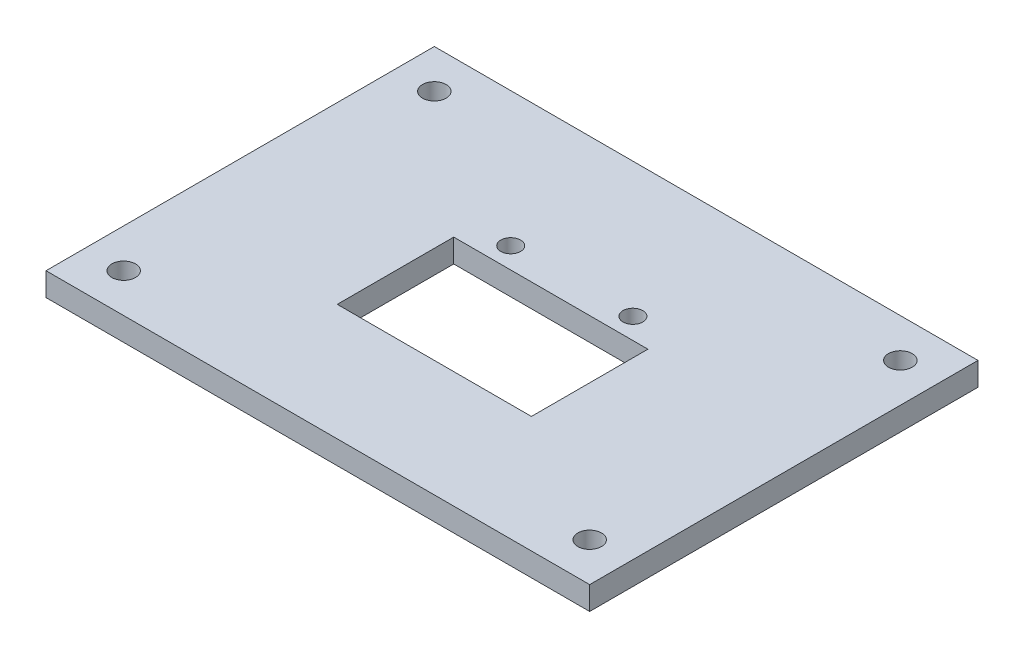
ISO-10303-21;
HEADER;
FILE_DESCRIPTION(('STEP AP214'),'2;1');
FILE_NAME('part.step','',(''),(''),'','','');
FILE_SCHEMA(('AUTOMOTIVE_DESIGN { 1 0 10303 214 1 1 1 1 }'));
ENDSEC;
DATA;
#1=APPLICATION_CONTEXT('core data for automotive mechanical design processes');
#2=APPLICATION_PROTOCOL_DEFINITION('international standard','automotive_design',2000,#1);
#3=PRODUCT_CONTEXT('',#1,'mechanical');
#4=PRODUCT('Part','Part','',(#3));
#5=PRODUCT_RELATED_PRODUCT_CATEGORY('part','',(#4));
#6=PRODUCT_DEFINITION_FORMATION('','',#4);
#7=PRODUCT_DEFINITION_CONTEXT('part definition',#1,'design');
#8=PRODUCT_DEFINITION('design','',#6,#7);
#9=PRODUCT_DEFINITION_SHAPE('','',#8);
#10=(LENGTH_UNIT() NAMED_UNIT(*) SI_UNIT(.MILLI.,.METRE.));
#11=(NAMED_UNIT(*) PLANE_ANGLE_UNIT() SI_UNIT($,.RADIAN.));
#12=(NAMED_UNIT(*) SI_UNIT($,.STERADIAN.) SOLID_ANGLE_UNIT());
#13=UNCERTAINTY_MEASURE_WITH_UNIT(LENGTH_MEASURE(1.E-05),#10,'distance_accuracy_value','');
#14=(GEOMETRIC_REPRESENTATION_CONTEXT(3) GLOBAL_UNCERTAINTY_ASSIGNED_CONTEXT((#13)) GLOBAL_UNIT_ASSIGNED_CONTEXT((#10,
#11,#12)) REPRESENTATION_CONTEXT('',''));
#15=CARTESIAN_POINT('',(0.,0.,0.));
#16=DIRECTION('',(0.,0.,1.));
#17=DIRECTION('',(1.,0.,0.));
#18=AXIS2_PLACEMENT_3D('',#15,#16,#17);
#19=CARTESIAN_POINT('',(0.,3.,0.));
#20=DIRECTION('',(1.,0.,0.));
#21=DIRECTION('',(0.,0.,-1.));
#22=AXIS2_PLACEMENT_3D('',#19,#20,#21);
#23=PLANE('',#22);
#24=DIRECTION('',(0.,0.,1.));
#25=VECTOR('',#24,1.);
#26=CARTESIAN_POINT('',(0.,0.,0.));
#27=LINE('',#26,#25);
#28=CARTESIAN_POINT('',(0.,0.,-50.));
#29=VERTEX_POINT('',#28);
#30=CARTESIAN_POINT('',(0.,0.,0.));
#31=VERTEX_POINT('',#30);
#32=EDGE_CURVE('E134',#29,#31,#27,.T.);
#33=ORIENTED_EDGE('',*,*,#32,.T.);
#34=DIRECTION('',(0.,-1.,0.));
#35=VECTOR('',#34,1.);
#36=CARTESIAN_POINT('',(0.,3.,0.));
#37=LINE('',#36,#35);
#38=CARTESIAN_POINT('',(0.,3.,0.));
#39=VERTEX_POINT('',#38);
#40=EDGE_CURVE('E11',#39,#31,#37,.T.);
#41=ORIENTED_EDGE('',*,*,#40,.F.);
#42=DIRECTION('',(0.,0.,1.));
#43=VECTOR('',#42,1.);
#44=CARTESIAN_POINT('',(0.,3.,0.));
#45=LINE('',#44,#43);
#46=CARTESIAN_POINT('',(0.,3.,-50.));
#47=VERTEX_POINT('',#46);
#48=EDGE_CURVE('E150',#47,#39,#45,.T.);
#49=ORIENTED_EDGE('',*,*,#48,.F.);
#50=DIRECTION('',(0.,-1.,0.));
#51=VECTOR('',#50,1.);
#52=CARTESIAN_POINT('',(0.,3.,-50.));
#53=LINE('',#52,#51);
#54=EDGE_CURVE('E160',#47,#29,#53,.T.);
#55=ORIENTED_EDGE('',*,*,#54,.T.);
#56=EDGE_LOOP('',(#33,#41,#49,#55));
#57=FACE_BOUND('',#56,.T.);
#58=ADVANCED_FACE('F33',(#57),#23,.F.);
#59=CARTESIAN_POINT('',(0.,3.,0.));
#60=DIRECTION('',(0.,0.,-1.));
#61=DIRECTION('',(-1.,0.,0.));
#62=AXIS2_PLACEMENT_3D('',#59,#60,#61);
#63=PLANE('',#62);
#64=DIRECTION('',(1.,0.,0.));
#65=VECTOR('',#64,1.);
#66=CARTESIAN_POINT('',(0.,0.,0.));
#67=LINE('',#66,#65);
#68=CARTESIAN_POINT('',(70.,0.,0.));
#69=VERTEX_POINT('',#68);
#70=EDGE_CURVE('E163',#31,#69,#67,.T.);
#71=ORIENTED_EDGE('',*,*,#70,.T.);
#72=DIRECTION('',(0.,-1.,0.));
#73=VECTOR('',#72,1.);
#74=CARTESIAN_POINT('',(70.,3.,0.));
#75=LINE('',#74,#73);
#76=CARTESIAN_POINT('',(70.,3.,0.));
#77=VERTEX_POINT('',#76);
#78=EDGE_CURVE('E40',#77,#69,#75,.T.);
#79=ORIENTED_EDGE('',*,*,#78,.F.);
#80=DIRECTION('',(1.,0.,0.));
#81=VECTOR('',#80,1.);
#82=CARTESIAN_POINT('',(0.,3.,0.));
#83=LINE('',#82,#81);
#84=EDGE_CURVE('E153',#39,#77,#83,.T.);
#85=ORIENTED_EDGE('',*,*,#84,.F.);
#86=ORIENTED_EDGE('',*,*,#40,.T.);
#87=EDGE_LOOP('',(#71,#79,#85,#86));
#88=FACE_BOUND('',#87,.T.);
#89=ADVANCED_FACE('F192',(#88),#63,.F.);
#90=CARTESIAN_POINT('',(70.,3.,0.));
#91=DIRECTION('',(-1.,0.,0.));
#92=DIRECTION('',(0.,0.,1.));
#93=AXIS2_PLACEMENT_3D('',#90,#91,#92);
#94=PLANE('',#93);
#95=DIRECTION('',(0.,0.,-1.));
#96=VECTOR('',#95,1.);
#97=CARTESIAN_POINT('',(70.,0.,0.));
#98=LINE('',#97,#96);
#99=CARTESIAN_POINT('',(70.,0.,-50.));
#100=VERTEX_POINT('',#99);
#101=EDGE_CURVE('E165',#69,#100,#98,.T.);
#102=ORIENTED_EDGE('',*,*,#101,.T.);
#103=DIRECTION('',(0.,-1.,0.));
#104=VECTOR('',#103,1.);
#105=CARTESIAN_POINT('',(70.,3.,-50.));
#106=LINE('',#105,#104);
#107=CARTESIAN_POINT('',(70.,3.,-50.));
#108=VERTEX_POINT('',#107);
#109=EDGE_CURVE('E170',#108,#100,#106,.T.);
#110=ORIENTED_EDGE('',*,*,#109,.F.);
#111=DIRECTION('',(0.,0.,-1.));
#112=VECTOR('',#111,1.);
#113=CARTESIAN_POINT('',(70.,3.,0.));
#114=LINE('',#113,#112);
#115=EDGE_CURVE('E156',#77,#108,#114,.T.);
#116=ORIENTED_EDGE('',*,*,#115,.F.);
#117=ORIENTED_EDGE('',*,*,#78,.T.);
#118=EDGE_LOOP('',(#102,#110,#116,#117));
#119=FACE_BOUND('',#118,.T.);
#120=ADVANCED_FACE('F177',(#119),#94,.F.);
#121=CARTESIAN_POINT('',(0.,3.,-50.));
#122=DIRECTION('',(0.,0.,1.));
#123=DIRECTION('',(1.,0.,0.));
#124=AXIS2_PLACEMENT_3D('',#121,#122,#123);
#125=PLANE('',#124);
#126=DIRECTION('',(-1.,0.,0.));
#127=VECTOR('',#126,1.);
#128=CARTESIAN_POINT('',(0.,0.,-50.));
#129=LINE('',#128,#127);
#130=EDGE_CURVE('E154',#100,#29,#129,.T.);
#131=ORIENTED_EDGE('',*,*,#130,.T.);
#132=ORIENTED_EDGE('',*,*,#54,.F.);
#133=DIRECTION('',(-1.,0.,0.));
#134=VECTOR('',#133,1.);
#135=CARTESIAN_POINT('',(0.,3.,-50.));
#136=LINE('',#135,#134);
#137=EDGE_CURVE('E158',#108,#47,#136,.T.);
#138=ORIENTED_EDGE('',*,*,#137,.F.);
#139=ORIENTED_EDGE('',*,*,#109,.T.);
#140=EDGE_LOOP('',(#131,#132,#138,#139));
#141=FACE_BOUND('',#140,.T.);
#142=ADVANCED_FACE('F185',(#141),#125,.F.);
#143=CARTESIAN_POINT('',(0.,3.,0.));
#144=DIRECTION('',(0.,-1.,0.));
#145=DIRECTION('',(0.,0.,-1.));
#146=AXIS2_PLACEMENT_3D('',#143,#144,#145);
#147=PLANE('',#146);
#148=CARTESIAN_POINT('',(5.,3.,-5.00000000000002));
#149=DIRECTION('',(0.,1.,0.));
#150=DIRECTION('',(0.,0.,-1.));
#151=AXIS2_PLACEMENT_3D('',#148,#149,#150);
#152=CIRCLE('',#151,1.525);
#153=CARTESIAN_POINT('',(5.,3.,-6.52500000000002));
#154=VERTEX_POINT('',#153);
#155=EDGE_CURVE('E264',#154,#154,#152,.T.);
#156=ORIENTED_EDGE('',*,*,#155,.F.);
#157=EDGE_LOOP('',(#156));
#158=FACE_BOUND('',#157,.T.);
#159=CARTESIAN_POINT('',(65.,3.,-5.00000000000002));
#160=DIRECTION('',(0.,1.,0.));
#161=DIRECTION('',(0.,0.,1.));
#162=AXIS2_PLACEMENT_3D('',#159,#160,#161);
#163=CIRCLE('',#162,1.52500000000001);
#164=CARTESIAN_POINT('',(65.,3.,-3.47500000000001));
#165=VERTEX_POINT('',#164);
#166=EDGE_CURVE('E256',#165,#165,#163,.T.);
#167=ORIENTED_EDGE('',*,*,#166,.F.);
#168=EDGE_LOOP('',(#167));
#169=FACE_BOUND('',#168,.T.);
#170=CARTESIAN_POINT('',(65.,3.,-45.));
#171=DIRECTION('',(0.,1.,0.));
#172=DIRECTION('',(0.,0.,-1.));
#173=AXIS2_PLACEMENT_3D('',#170,#171,#172);
#174=CIRCLE('',#173,1.52500000000001);
#175=CARTESIAN_POINT('',(65.,3.,-46.525));
#176=VERTEX_POINT('',#175);
#177=EDGE_CURVE('E250',#176,#176,#174,.T.);
#178=ORIENTED_EDGE('',*,*,#177,.F.);
#179=EDGE_LOOP('',(#178));
#180=FACE_BOUND('',#179,.T.);
#181=CARTESIAN_POINT('',(5.,3.,-45.));
#182=DIRECTION('',(0.,1.,0.));
#183=DIRECTION('',(0.,0.,1.));
#184=AXIS2_PLACEMENT_3D('',#181,#182,#183);
#185=CIRCLE('',#184,1.525);
#186=CARTESIAN_POINT('',(5.,3.,-43.475));
#187=VERTEX_POINT('',#186);
#188=EDGE_CURVE('E121',#187,#187,#185,.T.);
#189=ORIENTED_EDGE('',*,*,#188,.F.);
#190=EDGE_LOOP('',(#189));
#191=FACE_BOUND('',#190,.T.);
#192=DIRECTION('',(1.,0.,0.));
#193=VECTOR('',#192,1.);
#194=CARTESIAN_POINT('',(22.5,3.,-15.));
#195=LINE('',#194,#193);
#196=CARTESIAN_POINT('',(22.5,3.,-15.));
#197=VERTEX_POINT('',#196);
#198=CARTESIAN_POINT('',(47.5,3.,-15.));
#199=VERTEX_POINT('',#198);
#200=EDGE_CURVE('E127',#197,#199,#195,.T.);
#201=ORIENTED_EDGE('',*,*,#200,.F.);
#202=DIRECTION('',(0.,0.,1.));
#203=VECTOR('',#202,1.);
#204=CARTESIAN_POINT('',(22.5,3.,-30.));
#205=LINE('',#204,#203);
#206=CARTESIAN_POINT('',(22.5,3.,-30.));
#207=VERTEX_POINT('',#206);
#208=EDGE_CURVE('E47',#207,#197,#205,.T.);
#209=ORIENTED_EDGE('',*,*,#208,.F.);
#210=DIRECTION('',(-1.,0.,0.));
#211=VECTOR('',#210,1.);
#212=CARTESIAN_POINT('',(22.5,3.,-30.));
#213=LINE('',#212,#211);
#214=CARTESIAN_POINT('',(47.5,3.,-30.));
#215=VERTEX_POINT('',#214);
#216=EDGE_CURVE('E115',#215,#207,#213,.T.);
#217=ORIENTED_EDGE('',*,*,#216,.F.);
#218=DIRECTION('',(0.,0.,-1.));
#219=VECTOR('',#218,1.);
#220=CARTESIAN_POINT('',(47.5,3.,-30.));
#221=LINE('',#220,#219);
#222=EDGE_CURVE('E118',#199,#215,#221,.T.);
#223=ORIENTED_EDGE('',*,*,#222,.F.);
#224=EDGE_LOOP('',(#201,#209,#217,#223));
#225=FACE_BOUND('',#224,.T.);
#226=CARTESIAN_POINT('',(27.135,3.,-32.7));
#227=DIRECTION('',(0.,1.,0.));
#228=DIRECTION('',(0.,0.,1.));
#229=AXIS2_PLACEMENT_3D('',#226,#227,#228);
#230=CIRCLE('',#229,1.275);
#231=CARTESIAN_POINT('',(27.135,3.,-31.425));
#232=VERTEX_POINT('',#231);
#233=EDGE_CURVE('E140',#232,#232,#230,.T.);
#234=ORIENTED_EDGE('',*,*,#233,.F.);
#235=EDGE_LOOP('',(#234));
#236=FACE_BOUND('',#235,.T.);
#237=CARTESIAN_POINT('',(42.865,3.,-32.7));
#238=DIRECTION('',(0.,1.,0.));
#239=DIRECTION('',(0.,0.,-1.));
#240=AXIS2_PLACEMENT_3D('',#237,#238,#239);
#241=CIRCLE('',#240,1.275);
#242=CARTESIAN_POINT('',(42.865,3.,-33.975));
#243=VERTEX_POINT('',#242);
#244=EDGE_CURVE('E146',#243,#243,#241,.T.);
#245=ORIENTED_EDGE('',*,*,#244,.F.);
#246=EDGE_LOOP('',(#245));
#247=FACE_BOUND('',#246,.T.);
#248=ORIENTED_EDGE('',*,*,#48,.T.);
#249=ORIENTED_EDGE('',*,*,#84,.T.);
#250=ORIENTED_EDGE('',*,*,#115,.T.);
#251=ORIENTED_EDGE('',*,*,#137,.T.);
#252=EDGE_LOOP('',(#248,#249,#250,#251));
#253=FACE_BOUND('',#252,.T.);
#254=ADVANCED_FACE('F191',(#158,#169,#180,#191,#225,#236,#247,#253),#147,.F.);
#255=CARTESIAN_POINT('',(0.,0.,0.));
#256=DIRECTION('',(0.,-1.,0.));
#257=DIRECTION('',(0.,0.,-1.));
#258=AXIS2_PLACEMENT_3D('',#255,#256,#257);
#259=PLANE('',#258);
#260=CARTESIAN_POINT('',(5.,0.,-5.00000000000002));
#261=DIRECTION('',(0.,1.,0.));
#262=DIRECTION('',(0.,0.,-1.));
#263=AXIS2_PLACEMENT_3D('',#260,#261,#262);
#264=CIRCLE('',#263,1.525);
#265=CARTESIAN_POINT('',(5.,0.,-6.52500000000002));
#266=VERTEX_POINT('',#265);
#267=EDGE_CURVE('E261',#266,#266,#264,.T.);
#268=ORIENTED_EDGE('',*,*,#267,.T.);
#269=EDGE_LOOP('',(#268));
#270=FACE_BOUND('',#269,.T.);
#271=CARTESIAN_POINT('',(65.,0.,-5.00000000000002));
#272=DIRECTION('',(0.,1.,0.));
#273=DIRECTION('',(0.,0.,1.));
#274=AXIS2_PLACEMENT_3D('',#271,#272,#273);
#275=CIRCLE('',#274,1.52500000000001);
#276=CARTESIAN_POINT('',(65.,0.,-3.47500000000001));
#277=VERTEX_POINT('',#276);
#278=EDGE_CURVE('E252',#277,#277,#275,.T.);
#279=ORIENTED_EDGE('',*,*,#278,.T.);
#280=EDGE_LOOP('',(#279));
#281=FACE_BOUND('',#280,.T.);
#282=CARTESIAN_POINT('',(65.,0.,-45.));
#283=DIRECTION('',(0.,1.,0.));
#284=DIRECTION('',(0.,0.,-1.));
#285=AXIS2_PLACEMENT_3D('',#282,#283,#284);
#286=CIRCLE('',#285,1.52500000000001);
#287=CARTESIAN_POINT('',(65.,0.,-46.525));
#288=VERTEX_POINT('',#287);
#289=EDGE_CURVE('E247',#288,#288,#286,.T.);
#290=ORIENTED_EDGE('',*,*,#289,.T.);
#291=EDGE_LOOP('',(#290));
#292=FACE_BOUND('',#291,.T.);
#293=CARTESIAN_POINT('',(5.,0.,-45.));
#294=DIRECTION('',(0.,1.,0.));
#295=DIRECTION('',(0.,0.,1.));
#296=AXIS2_PLACEMENT_3D('',#293,#294,#295);
#297=CIRCLE('',#296,1.525);
#298=CARTESIAN_POINT('',(5.,0.,-43.475));
#299=VERTEX_POINT('',#298);
#300=EDGE_CURVE('E149',#299,#299,#297,.T.);
#301=ORIENTED_EDGE('',*,*,#300,.T.);
#302=EDGE_LOOP('',(#301));
#303=FACE_BOUND('',#302,.T.);
#304=DIRECTION('',(0.,0.,1.));
#305=VECTOR('',#304,1.);
#306=CARTESIAN_POINT('',(22.5,0.,-30.));
#307=LINE('',#306,#305);
#308=CARTESIAN_POINT('',(22.5,0.,-30.));
#309=VERTEX_POINT('',#308);
#310=CARTESIAN_POINT('',(22.5,0.,-15.));
#311=VERTEX_POINT('',#310);
#312=EDGE_CURVE('E99',#309,#311,#307,.T.);
#313=ORIENTED_EDGE('',*,*,#312,.T.);
#314=DIRECTION('',(1.,0.,0.));
#315=VECTOR('',#314,1.);
#316=CARTESIAN_POINT('',(22.5,0.,-15.));
#317=LINE('',#316,#315);
#318=CARTESIAN_POINT('',(47.5,0.,-15.));
#319=VERTEX_POINT('',#318);
#320=EDGE_CURVE('E108',#311,#319,#317,.T.);
#321=ORIENTED_EDGE('',*,*,#320,.T.);
#322=DIRECTION('',(0.,0.,-1.));
#323=VECTOR('',#322,1.);
#324=CARTESIAN_POINT('',(47.5,0.,-30.));
#325=LINE('',#324,#323);
#326=CARTESIAN_POINT('',(47.5,0.,-30.));
#327=VERTEX_POINT('',#326);
#328=EDGE_CURVE('E55',#319,#327,#325,.T.);
#329=ORIENTED_EDGE('',*,*,#328,.T.);
#330=DIRECTION('',(-1.,0.,0.));
#331=VECTOR('',#330,1.);
#332=CARTESIAN_POINT('',(22.5,0.,-30.));
#333=LINE('',#332,#331);
#334=EDGE_CURVE('E105',#327,#309,#333,.T.);
#335=ORIENTED_EDGE('',*,*,#334,.T.);
#336=EDGE_LOOP('',(#313,#321,#329,#335));
#337=FACE_BOUND('',#336,.T.);
#338=CARTESIAN_POINT('',(27.135,0.,-32.7));
#339=DIRECTION('',(0.,1.,0.));
#340=DIRECTION('',(0.,0.,1.));
#341=AXIS2_PLACEMENT_3D('',#338,#339,#340);
#342=CIRCLE('',#341,1.275);
#343=CARTESIAN_POINT('',(27.135,0.,-31.425));
#344=VERTEX_POINT('',#343);
#345=EDGE_CURVE('E128',#344,#344,#342,.T.);
#346=ORIENTED_EDGE('',*,*,#345,.T.);
#347=EDGE_LOOP('',(#346));
#348=FACE_BOUND('',#347,.T.);
#349=CARTESIAN_POINT('',(42.865,0.,-32.7));
#350=DIRECTION('',(0.,1.,0.));
#351=DIRECTION('',(0.,0.,-1.));
#352=AXIS2_PLACEMENT_3D('',#349,#350,#351);
#353=CIRCLE('',#352,1.275);
#354=CARTESIAN_POINT('',(42.865,0.,-33.975));
#355=VERTEX_POINT('',#354);
#356=EDGE_CURVE('E143',#355,#355,#353,.T.);
#357=ORIENTED_EDGE('',*,*,#356,.T.);
#358=EDGE_LOOP('',(#357));
#359=FACE_BOUND('',#358,.T.);
#360=ORIENTED_EDGE('',*,*,#32,.F.);
#361=ORIENTED_EDGE('',*,*,#130,.F.);
#362=ORIENTED_EDGE('',*,*,#101,.F.);
#363=ORIENTED_EDGE('',*,*,#70,.F.);
#364=EDGE_LOOP('',(#360,#361,#362,#363));
#365=FACE_BOUND('',#364,.T.);
#366=ADVANCED_FACE('F112',(#270,#281,#292,#303,#337,#348,#359,#365),#259,.T.);
#367=CARTESIAN_POINT('',(42.865,0.,-32.7));
#368=DIRECTION('',(0.,1.,0.));
#369=DIRECTION('',(0.,0.,1.));
#370=AXIS2_PLACEMENT_3D('',#367,#368,#369);
#371=CYLINDRICAL_SURFACE('',#370,1.275);
#372=ORIENTED_EDGE('',*,*,#356,.F.);
#373=EDGE_LOOP('',(#372));
#374=FACE_BOUND('',#373,.T.);
#375=ORIENTED_EDGE('',*,*,#244,.T.);
#376=EDGE_LOOP('',(#375));
#377=FACE_BOUND('',#376,.T.);
#378=ADVANCED_FACE('F204',(#374,#377),#371,.F.);
#379=CARTESIAN_POINT('',(27.135,0.,-32.7));
#380=DIRECTION('',(0.,1.,0.));
#381=DIRECTION('',(0.,0.,1.));
#382=AXIS2_PLACEMENT_3D('',#379,#380,#381);
#383=CYLINDRICAL_SURFACE('',#382,1.275);
#384=ORIENTED_EDGE('',*,*,#345,.F.);
#385=EDGE_LOOP('',(#384));
#386=FACE_BOUND('',#385,.T.);
#387=ORIENTED_EDGE('',*,*,#233,.T.);
#388=EDGE_LOOP('',(#387));
#389=FACE_BOUND('',#388,.T.);
#390=ADVANCED_FACE('F211',(#386,#389),#383,.F.);
#391=CARTESIAN_POINT('',(22.5,0.,-30.));
#392=DIRECTION('',(-1.,0.,0.));
#393=DIRECTION('',(0.,0.,1.));
#394=AXIS2_PLACEMENT_3D('',#391,#392,#393);
#395=PLANE('',#394);
#396=ORIENTED_EDGE('',*,*,#208,.T.);
#397=DIRECTION('',(0.,1.,0.));
#398=VECTOR('',#397,1.);
#399=CARTESIAN_POINT('',(22.5,0.,-15.));
#400=LINE('',#399,#398);
#401=EDGE_CURVE('E95',#311,#197,#400,.T.);
#402=ORIENTED_EDGE('',*,*,#401,.F.);
#403=ORIENTED_EDGE('',*,*,#312,.F.);
#404=DIRECTION('',(0.,1.,0.));
#405=VECTOR('',#404,1.);
#406=CARTESIAN_POINT('',(22.5,0.,-30.));
#407=LINE('',#406,#405);
#408=EDGE_CURVE('E132',#309,#207,#407,.T.);
#409=ORIENTED_EDGE('',*,*,#408,.T.);
#410=EDGE_LOOP('',(#396,#402,#403,#409));
#411=FACE_BOUND('',#410,.T.);
#412=ADVANCED_FACE('F97',(#411),#395,.F.);
#413=CARTESIAN_POINT('',(22.5,0.,-30.));
#414=DIRECTION('',(0.,0.,-1.));
#415=DIRECTION('',(-1.,0.,0.));
#416=AXIS2_PLACEMENT_3D('',#413,#414,#415);
#417=PLANE('',#416);
#418=ORIENTED_EDGE('',*,*,#216,.T.);
#419=ORIENTED_EDGE('',*,*,#408,.F.);
#420=ORIENTED_EDGE('',*,*,#334,.F.);
#421=DIRECTION('',(0.,1.,0.));
#422=VECTOR('',#421,1.);
#423=CARTESIAN_POINT('',(47.5,0.,-30.));
#424=LINE('',#423,#422);
#425=EDGE_CURVE('E135',#327,#215,#424,.T.);
#426=ORIENTED_EDGE('',*,*,#425,.T.);
#427=EDGE_LOOP('',(#418,#419,#420,#426));
#428=FACE_BOUND('',#427,.T.);
#429=ADVANCED_FACE('F218',(#428),#417,.F.);
#430=CARTESIAN_POINT('',(47.5,0.,-30.));
#431=DIRECTION('',(1.,0.,0.));
#432=DIRECTION('',(0.,0.,-1.));
#433=AXIS2_PLACEMENT_3D('',#430,#431,#432);
#434=PLANE('',#433);
#435=ORIENTED_EDGE('',*,*,#222,.T.);
#436=ORIENTED_EDGE('',*,*,#425,.F.);
#437=ORIENTED_EDGE('',*,*,#328,.F.);
#438=DIRECTION('',(0.,1.,0.));
#439=VECTOR('',#438,1.);
#440=CARTESIAN_POINT('',(47.5,0.,-15.));
#441=LINE('',#440,#439);
#442=EDGE_CURVE('E104',#319,#199,#441,.T.);
#443=ORIENTED_EDGE('',*,*,#442,.T.);
#444=EDGE_LOOP('',(#435,#436,#437,#443));
#445=FACE_BOUND('',#444,.T.);
#446=ADVANCED_FACE('F222',(#445),#434,.F.);
#447=CARTESIAN_POINT('',(22.5,0.,-15.));
#448=DIRECTION('',(0.,0.,1.));
#449=DIRECTION('',(1.,0.,0.));
#450=AXIS2_PLACEMENT_3D('',#447,#448,#449);
#451=PLANE('',#450);
#452=ORIENTED_EDGE('',*,*,#200,.T.);
#453=ORIENTED_EDGE('',*,*,#442,.F.);
#454=ORIENTED_EDGE('',*,*,#320,.F.);
#455=ORIENTED_EDGE('',*,*,#401,.T.);
#456=EDGE_LOOP('',(#452,#453,#454,#455));
#457=FACE_BOUND('',#456,.T.);
#458=ADVANCED_FACE('F109',(#457),#451,.F.);
#459=CARTESIAN_POINT('',(5.,0.,-45.));
#460=DIRECTION('',(0.,1.,0.));
#461=DIRECTION('',(0.,0.,1.));
#462=AXIS2_PLACEMENT_3D('',#459,#460,#461);
#463=CYLINDRICAL_SURFACE('',#462,1.525);
#464=ORIENTED_EDGE('',*,*,#300,.F.);
#465=EDGE_LOOP('',(#464));
#466=FACE_BOUND('',#465,.T.);
#467=ORIENTED_EDGE('',*,*,#188,.T.);
#468=EDGE_LOOP('',(#467));
#469=FACE_BOUND('',#468,.T.);
#470=ADVANCED_FACE('F221',(#466,#469),#463,.F.);
#471=CARTESIAN_POINT('',(65.,0.,-45.));
#472=DIRECTION('',(0.,1.,0.));
#473=DIRECTION('',(0.,0.,1.));
#474=AXIS2_PLACEMENT_3D('',#471,#472,#473);
#475=CYLINDRICAL_SURFACE('',#474,1.52500000000001);
#476=ORIENTED_EDGE('',*,*,#289,.F.);
#477=EDGE_LOOP('',(#476));
#478=FACE_BOUND('',#477,.T.);
#479=ORIENTED_EDGE('',*,*,#177,.T.);
#480=EDGE_LOOP('',(#479));
#481=FACE_BOUND('',#480,.T.);
#482=ADVANCED_FACE('F230',(#478,#481),#475,.F.);
#483=CARTESIAN_POINT('',(65.,0.,-5.00000000000002));
#484=DIRECTION('',(0.,1.,0.));
#485=DIRECTION('',(0.,0.,1.));
#486=AXIS2_PLACEMENT_3D('',#483,#484,#485);
#487=CYLINDRICAL_SURFACE('',#486,1.52500000000001);
#488=ORIENTED_EDGE('',*,*,#278,.F.);
#489=EDGE_LOOP('',(#488));
#490=FACE_BOUND('',#489,.T.);
#491=ORIENTED_EDGE('',*,*,#166,.T.);
#492=EDGE_LOOP('',(#491));
#493=FACE_BOUND('',#492,.T.);
#494=ADVANCED_FACE('F235',(#490,#493),#487,.F.);
#495=CARTESIAN_POINT('',(5.,0.,-5.00000000000002));
#496=DIRECTION('',(0.,1.,0.));
#497=DIRECTION('',(0.,0.,1.));
#498=AXIS2_PLACEMENT_3D('',#495,#496,#497);
#499=CYLINDRICAL_SURFACE('',#498,1.525);
#500=ORIENTED_EDGE('',*,*,#267,.F.);
#501=EDGE_LOOP('',(#500));
#502=FACE_BOUND('',#501,.T.);
#503=ORIENTED_EDGE('',*,*,#155,.T.);
#504=EDGE_LOOP('',(#503));
#505=FACE_BOUND('',#504,.T.);
#506=ADVANCED_FACE('F232',(#502,#505),#499,.F.);
#507=CLOSED_SHELL('',(#58,#89,#120,#142,#254,#366,#378,#390,#412,#429,#446,#458,#470,#482,#494,#506));
#508=MANIFOLD_SOLID_BREP('B2',#507);
#509=ADVANCED_BREP_SHAPE_REPRESENTATION('',(#18,#508),#14);
#510=SHAPE_DEFINITION_REPRESENTATION(#9,#509);
ENDSEC;
END-ISO-10303-21;
